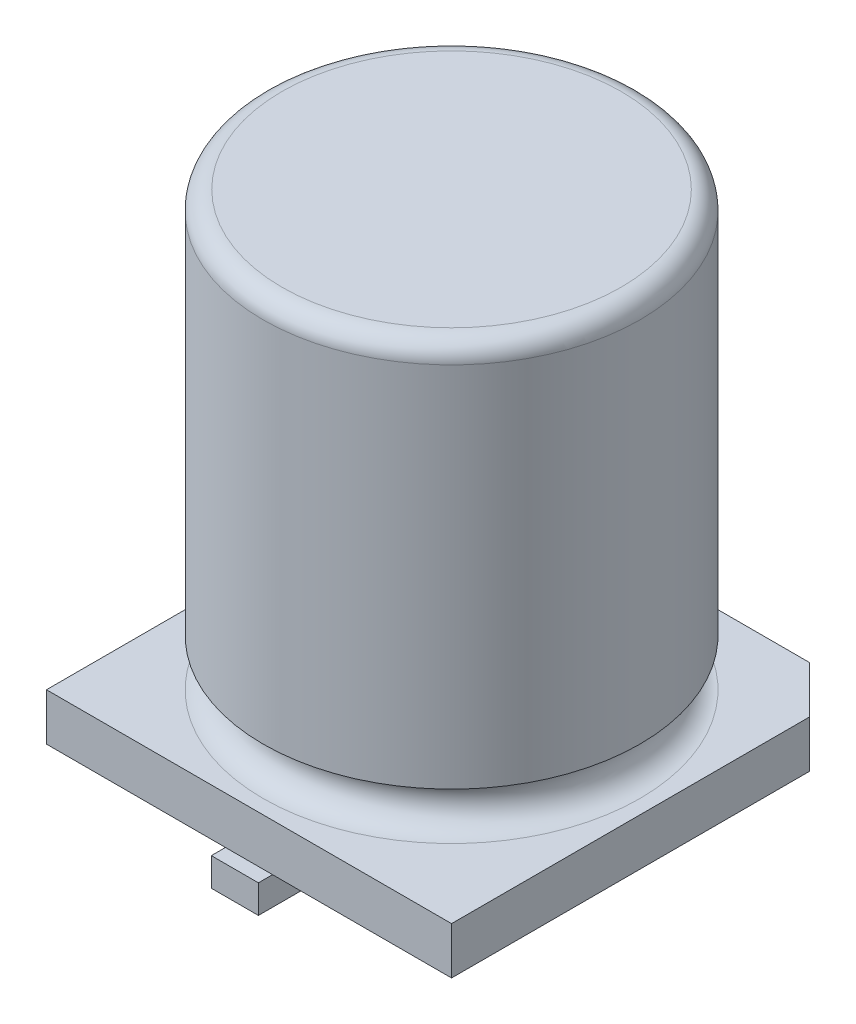
ISO-10303-21;
HEADER;
FILE_DESCRIPTION(('STEP AP214'),'2;1');
FILE_NAME('part.step','',(''),(''),'','','');
FILE_SCHEMA(('AUTOMOTIVE_DESIGN { 1 0 10303 214 1 1 1 1 }'));
ENDSEC;
DATA;
#1=APPLICATION_CONTEXT('core data for automotive mechanical design processes');
#2=APPLICATION_PROTOCOL_DEFINITION('international standard','automotive_design',2000,#1);
#3=PRODUCT_CONTEXT('',#1,'mechanical');
#4=PRODUCT('Part','Part','',(#3));
#5=PRODUCT_RELATED_PRODUCT_CATEGORY('part','',(#4));
#6=PRODUCT_DEFINITION_FORMATION('','',#4);
#7=PRODUCT_DEFINITION_CONTEXT('part definition',#1,'design');
#8=PRODUCT_DEFINITION('design','',#6,#7);
#9=PRODUCT_DEFINITION_SHAPE('','',#8);
#10=(LENGTH_UNIT() NAMED_UNIT(*) SI_UNIT(.MILLI.,.METRE.));
#11=(NAMED_UNIT(*) PLANE_ANGLE_UNIT() SI_UNIT($,.RADIAN.));
#12=(NAMED_UNIT(*) SI_UNIT($,.STERADIAN.) SOLID_ANGLE_UNIT());
#13=UNCERTAINTY_MEASURE_WITH_UNIT(LENGTH_MEASURE(1.E-05),#10,'distance_accuracy_value','');
#14=(GEOMETRIC_REPRESENTATION_CONTEXT(3) GLOBAL_UNCERTAINTY_ASSIGNED_CONTEXT((#13)) GLOBAL_UNIT_ASSIGNED_CONTEXT((#10,
#11,#12)) REPRESENTATION_CONTEXT('',''));
#15=CARTESIAN_POINT('',(0.,0.,0.));
#16=DIRECTION('',(0.,0.,1.));
#17=DIRECTION('',(1.,0.,0.));
#18=AXIS2_PLACEMENT_3D('',#15,#16,#17);
#19=CARTESIAN_POINT('',(0.,0.8,0.));
#20=DIRECTION('',(0.,1.,0.));
#21=DIRECTION('',(0.,0.,1.));
#22=AXIS2_PLACEMENT_3D('',#19,#20,#21);
#23=PLANE('',#22);
#24=DIRECTION('',(-0.707106781186548,0.,0.707106781186547));
#25=VECTOR('',#24,1.);
#26=CARTESIAN_POINT('',(-2.15,0.8,-1.65));
#27=LINE('',#26,#25);
#28=CARTESIAN_POINT('',(-1.65,0.8,-2.15));
#29=VERTEX_POINT('',#28);
#30=CARTESIAN_POINT('',(-2.15,0.8,-1.65));
#31=VERTEX_POINT('',#30);
#32=EDGE_CURVE('E195',#29,#31,#27,.T.);
#33=ORIENTED_EDGE('',*,*,#32,.T.);
#34=DIRECTION('',(0.,0.,1.));
#35=VECTOR('',#34,1.);
#36=CARTESIAN_POINT('',(-2.15,0.8,2.15));
#37=LINE('',#36,#35);
#38=CARTESIAN_POINT('',(-2.15,0.8,2.15));
#39=VERTEX_POINT('',#38);
#40=EDGE_CURVE('E198',#31,#39,#37,.T.);
#41=ORIENTED_EDGE('',*,*,#40,.T.);
#42=DIRECTION('',(1.,0.,0.));
#43=VECTOR('',#42,1.);
#44=CARTESIAN_POINT('',(-2.15,0.8,2.15));
#45=LINE('',#44,#43);
#46=CARTESIAN_POINT('',(2.15,0.8,2.15));
#47=VERTEX_POINT('',#46);
#48=EDGE_CURVE('E201',#39,#47,#45,.T.);
#49=ORIENTED_EDGE('',*,*,#48,.T.);
#50=DIRECTION('',(0.,0.,-1.));
#51=VECTOR('',#50,1.);
#52=CARTESIAN_POINT('',(2.15,0.8,2.15));
#53=LINE('',#52,#51);
#54=CARTESIAN_POINT('',(2.15,0.8,-1.65));
#55=VERTEX_POINT('',#54);
#56=EDGE_CURVE('E203',#47,#55,#53,.T.);
#57=ORIENTED_EDGE('',*,*,#56,.T.);
#58=DIRECTION('',(-0.707106781186548,0.,-0.707106781186547));
#59=VECTOR('',#58,1.);
#60=CARTESIAN_POINT('',(2.15,0.8,-1.65));
#61=LINE('',#60,#59);
#62=CARTESIAN_POINT('',(1.65,0.8,-2.15));
#63=VERTEX_POINT('',#62);
#64=EDGE_CURVE('E205',#55,#63,#61,.T.);
#65=ORIENTED_EDGE('',*,*,#64,.T.);
#66=DIRECTION('',(-1.,0.,0.));
#67=VECTOR('',#66,1.);
#68=CARTESIAN_POINT('',(1.65,0.8,-2.15));
#69=LINE('',#68,#67);
#70=EDGE_CURVE('E207',#63,#29,#69,.T.);
#71=ORIENTED_EDGE('',*,*,#70,.T.);
#72=EDGE_LOOP('',(#33,#41,#49,#57,#65,#71));
#73=FACE_BOUND('',#72,.T.);
#74=CARTESIAN_POINT('',(0.,0.8,0.));
#75=DIRECTION('',(0.,1.,0.));
#76=DIRECTION('',(0.,0.,1.));
#77=AXIS2_PLACEMENT_3D('',#74,#75,#76);
#78=CIRCLE('',#77,2.);
#79=CARTESIAN_POINT('',(0.,0.8,2.));
#80=VERTEX_POINT('',#79);
#81=EDGE_CURVE('E180',#80,#80,#78,.F.);
#82=ORIENTED_EDGE('',*,*,#81,.T.);
#83=EDGE_LOOP('',(#82));
#84=FACE_BOUND('',#83,.T.);
#85=ADVANCED_FACE('F33',(#73,#84),#23,.T.);
#86=CARTESIAN_POINT('',(0.,0.3,0.));
#87=DIRECTION('',(0.,1.,0.));
#88=DIRECTION('',(0.,0.,1.));
#89=AXIS2_PLACEMENT_3D('',#86,#87,#88);
#90=PLANE('',#89);
#91=DIRECTION('',(0.,0.,1.));
#92=VECTOR('',#91,1.);
#93=CARTESIAN_POINT('',(-0.25,0.3,2.3));
#94=LINE('',#93,#92);
#95=CARTESIAN_POINT('',(-0.25,0.3,0.75));
#96=VERTEX_POINT('',#95);
#97=CARTESIAN_POINT('',(-0.25,0.3,2.15));
#98=VERTEX_POINT('',#97);
#99=EDGE_CURVE('E148',#96,#98,#94,.T.);
#100=ORIENTED_EDGE('',*,*,#99,.T.);
#101=DIRECTION('',(1.,0.,0.));
#102=VECTOR('',#101,1.);
#103=CARTESIAN_POINT('',(-2.15,0.3,2.15));
#104=LINE('',#103,#102);
#105=CARTESIAN_POINT('',(-2.15,0.3,2.15));
#106=VERTEX_POINT('',#105);
#107=EDGE_CURVE('E215',#106,#98,#104,.T.);
#108=ORIENTED_EDGE('',*,*,#107,.F.);
#109=DIRECTION('',(0.,0.,1.));
#110=VECTOR('',#109,1.);
#111=CARTESIAN_POINT('',(-2.15,0.3,2.15));
#112=LINE('',#111,#110);
#113=CARTESIAN_POINT('',(-2.15,0.3,-1.65));
#114=VERTEX_POINT('',#113);
#115=EDGE_CURVE('E212',#114,#106,#112,.T.);
#116=ORIENTED_EDGE('',*,*,#115,.F.);
#117=DIRECTION('',(-0.707106781186548,0.,0.707106781186547));
#118=VECTOR('',#117,1.);
#119=CARTESIAN_POINT('',(-2.15,0.3,-1.65));
#120=LINE('',#119,#118);
#121=CARTESIAN_POINT('',(-1.65,0.3,-2.15));
#122=VERTEX_POINT('',#121);
#123=EDGE_CURVE('E169',#122,#114,#120,.T.);
#124=ORIENTED_EDGE('',*,*,#123,.F.);
#125=DIRECTION('',(-1.,0.,0.));
#126=VECTOR('',#125,1.);
#127=CARTESIAN_POINT('',(1.65,0.3,-2.15));
#128=LINE('',#127,#126);
#129=CARTESIAN_POINT('',(-0.25,0.3,-2.15));
#130=VERTEX_POINT('',#129);
#131=EDGE_CURVE('E222',#130,#122,#128,.T.);
#132=ORIENTED_EDGE('',*,*,#131,.F.);
#133=DIRECTION('',(0.,0.,1.));
#134=VECTOR('',#133,1.);
#135=CARTESIAN_POINT('',(-0.25,0.3,-2.3));
#136=LINE('',#135,#134);
#137=CARTESIAN_POINT('',(-0.25,0.3,-0.75));
#138=VERTEX_POINT('',#137);
#139=EDGE_CURVE('E253',#130,#138,#136,.T.);
#140=ORIENTED_EDGE('',*,*,#139,.T.);
#141=CARTESIAN_POINT('',(0.,0.3,-0.75));
#142=DIRECTION('',(0.,1.,0.));
#143=DIRECTION('',(0.,0.,1.));
#144=AXIS2_PLACEMENT_3D('',#141,#142,#143);
#145=CIRCLE('',#144,0.25);
#146=CARTESIAN_POINT('',(0.25,0.3,-0.75));
#147=VERTEX_POINT('',#146);
#148=EDGE_CURVE('E243',#138,#147,#145,.T.);
#149=ORIENTED_EDGE('',*,*,#148,.T.);
#150=DIRECTION('',(0.,0.,-1.));
#151=VECTOR('',#150,1.);
#152=CARTESIAN_POINT('',(0.25,0.3,-0.75));
#153=LINE('',#152,#151);
#154=CARTESIAN_POINT('',(0.25,0.3,-2.15));
#155=VERTEX_POINT('',#154);
#156=EDGE_CURVE('E248',#147,#155,#153,.T.);
#157=ORIENTED_EDGE('',*,*,#156,.T.);
#158=CARTESIAN_POINT('',(1.65,0.3,-2.15));
#159=VERTEX_POINT('',#158);
#160=EDGE_CURVE('E199',#159,#155,#128,.T.);
#161=ORIENTED_EDGE('',*,*,#160,.F.);
#162=DIRECTION('',(-0.707106781186548,0.,-0.707106781186547));
#163=VECTOR('',#162,1.);
#164=CARTESIAN_POINT('',(2.15,0.3,-1.65));
#165=LINE('',#164,#163);
#166=CARTESIAN_POINT('',(2.15,0.3,-1.65));
#167=VERTEX_POINT('',#166);
#168=EDGE_CURVE('E220',#167,#159,#165,.T.);
#169=ORIENTED_EDGE('',*,*,#168,.F.);
#170=DIRECTION('',(0.,0.,-1.));
#171=VECTOR('',#170,1.);
#172=CARTESIAN_POINT('',(2.15,0.3,2.15));
#173=LINE('',#172,#171);
#174=CARTESIAN_POINT('',(2.15,0.3,2.15));
#175=VERTEX_POINT('',#174);
#176=EDGE_CURVE('E217',#175,#167,#173,.T.);
#177=ORIENTED_EDGE('',*,*,#176,.F.);
#178=CARTESIAN_POINT('',(0.25,0.3,2.15));
#179=VERTEX_POINT('',#178);
#180=EDGE_CURVE('E214',#179,#175,#104,.T.);
#181=ORIENTED_EDGE('',*,*,#180,.F.);
#182=DIRECTION('',(0.,0.,-1.));
#183=VECTOR('',#182,1.);
#184=CARTESIAN_POINT('',(0.25,0.3,0.75));
#185=LINE('',#184,#183);
#186=CARTESIAN_POINT('',(0.25,0.3,0.75));
#187=VERTEX_POINT('',#186);
#188=EDGE_CURVE('E174',#179,#187,#185,.T.);
#189=ORIENTED_EDGE('',*,*,#188,.T.);
#190=CARTESIAN_POINT('',(0.,0.3,0.75));
#191=DIRECTION('',(0.,1.,0.));
#192=DIRECTION('',(0.,0.,-1.));
#193=AXIS2_PLACEMENT_3D('',#190,#191,#192);
#194=CIRCLE('',#193,0.25);
#195=EDGE_CURVE('E165',#187,#96,#194,.T.);
#196=ORIENTED_EDGE('',*,*,#195,.T.);
#197=EDGE_LOOP('',(#100,#108,#116,#124,#132,#140,#149,#157,#161,#169,#177,#181,#189,#196));
#198=FACE_BOUND('',#197,.T.);
#199=ADVANCED_FACE('F172',(#198),#90,.F.);
#200=CARTESIAN_POINT('',(0.,0.3,-0.75));
#201=DIRECTION('',(0.,-1.,0.));
#202=DIRECTION('',(0.,0.,-1.));
#203=AXIS2_PLACEMENT_3D('',#200,#201,#202);
#204=CYLINDRICAL_SURFACE('',#203,0.25);
#205=CARTESIAN_POINT('',(0.,0.,-0.75));
#206=DIRECTION('',(0.,1.,0.));
#207=DIRECTION('',(0.,0.,1.));
#208=AXIS2_PLACEMENT_3D('',#205,#206,#207);
#209=CIRCLE('',#208,0.25);
#210=CARTESIAN_POINT('',(-0.25,0.,-0.75));
#211=VERTEX_POINT('',#210);
#212=CARTESIAN_POINT('',(0.25,0.,-0.75));
#213=VERTEX_POINT('',#212);
#214=EDGE_CURVE('E242',#211,#213,#209,.T.);
#215=ORIENTED_EDGE('',*,*,#214,.T.);
#216=DIRECTION('',(0.,-1.,0.));
#217=VECTOR('',#216,1.);
#218=CARTESIAN_POINT('',(0.25,0.3,-0.75));
#219=LINE('',#218,#217);
#220=EDGE_CURVE('E272',#147,#213,#219,.T.);
#221=ORIENTED_EDGE('',*,*,#220,.F.);
#222=ORIENTED_EDGE('',*,*,#148,.F.);
#223=DIRECTION('',(0.,-1.,0.));
#224=VECTOR('',#223,1.);
#225=CARTESIAN_POINT('',(-0.25,0.3,-0.75));
#226=LINE('',#225,#224);
#227=EDGE_CURVE('E256',#138,#211,#226,.T.);
#228=ORIENTED_EDGE('',*,*,#227,.T.);
#229=EDGE_LOOP('',(#215,#221,#222,#228));
#230=FACE_BOUND('',#229,.T.);
#231=ADVANCED_FACE('F307',(#230),#204,.T.);
#232=CARTESIAN_POINT('',(0.25,0.3,-0.75));
#233=DIRECTION('',(-1.,0.,0.));
#234=DIRECTION('',(0.,0.,1.));
#235=AXIS2_PLACEMENT_3D('',#232,#233,#234);
#236=PLANE('',#235);
#237=DIRECTION('',(0.,0.,-1.));
#238=VECTOR('',#237,1.);
#239=CARTESIAN_POINT('',(0.25,0.,-0.75));
#240=LINE('',#239,#238);
#241=CARTESIAN_POINT('',(0.25,0.,-2.3));
#242=VERTEX_POINT('',#241);
#243=EDGE_CURVE('E259',#213,#242,#240,.T.);
#244=ORIENTED_EDGE('',*,*,#243,.T.);
#245=DIRECTION('',(0.,-1.,0.));
#246=VECTOR('',#245,1.);
#247=CARTESIAN_POINT('',(0.25,0.3,-2.3));
#248=LINE('',#247,#246);
#249=CARTESIAN_POINT('',(0.25,0.3,-2.3));
#250=VERTEX_POINT('',#249);
#251=EDGE_CURVE('E269',#250,#242,#248,.T.);
#252=ORIENTED_EDGE('',*,*,#251,.F.);
#253=EDGE_CURVE('E246',#155,#250,#153,.T.);
#254=ORIENTED_EDGE('',*,*,#253,.F.);
#255=ORIENTED_EDGE('',*,*,#156,.F.);
#256=ORIENTED_EDGE('',*,*,#220,.T.);
#257=EDGE_LOOP('',(#244,#252,#254,#255,#256));
#258=FACE_BOUND('',#257,.T.);
#259=ADVANCED_FACE('F304',(#258),#236,.F.);
#260=CARTESIAN_POINT('',(0.25,0.3,-2.3));
#261=DIRECTION('',(0.,0.,1.));
#262=DIRECTION('',(1.,0.,0.));
#263=AXIS2_PLACEMENT_3D('',#260,#261,#262);
#264=PLANE('',#263);
#265=DIRECTION('',(-1.,0.,0.));
#266=VECTOR('',#265,1.);
#267=CARTESIAN_POINT('',(0.25,0.,-2.3));
#268=LINE('',#267,#266);
#269=CARTESIAN_POINT('',(-0.25,0.,-2.3));
#270=VERTEX_POINT('',#269);
#271=EDGE_CURVE('E261',#242,#270,#268,.T.);
#272=ORIENTED_EDGE('',*,*,#271,.T.);
#273=DIRECTION('',(0.,-1.,0.));
#274=VECTOR('',#273,1.);
#275=CARTESIAN_POINT('',(-0.25,0.3,-2.3));
#276=LINE('',#275,#274);
#277=CARTESIAN_POINT('',(-0.25,0.3,-2.3));
#278=VERTEX_POINT('',#277);
#279=EDGE_CURVE('E266',#278,#270,#276,.T.);
#280=ORIENTED_EDGE('',*,*,#279,.F.);
#281=DIRECTION('',(-1.,0.,0.));
#282=VECTOR('',#281,1.);
#283=CARTESIAN_POINT('',(0.25,0.3,-2.3));
#284=LINE('',#283,#282);
#285=EDGE_CURVE('E251',#250,#278,#284,.T.);
#286=ORIENTED_EDGE('',*,*,#285,.F.);
#287=ORIENTED_EDGE('',*,*,#251,.T.);
#288=EDGE_LOOP('',(#272,#280,#286,#287));
#289=FACE_BOUND('',#288,.T.);
#290=ADVANCED_FACE('F315',(#289),#264,.F.);
#291=CARTESIAN_POINT('',(-0.25,0.3,-2.3));
#292=DIRECTION('',(1.,0.,0.));
#293=DIRECTION('',(0.,0.,-1.));
#294=AXIS2_PLACEMENT_3D('',#291,#292,#293);
#295=PLANE('',#294);
#296=DIRECTION('',(0.,0.,1.));
#297=VECTOR('',#296,1.);
#298=CARTESIAN_POINT('',(-0.25,0.,-2.3));
#299=LINE('',#298,#297);
#300=EDGE_CURVE('E247',#270,#211,#299,.T.);
#301=ORIENTED_EDGE('',*,*,#300,.T.);
#302=ORIENTED_EDGE('',*,*,#227,.F.);
#303=ORIENTED_EDGE('',*,*,#139,.F.);
#304=EDGE_CURVE('E254',#278,#130,#136,.T.);
#305=ORIENTED_EDGE('',*,*,#304,.F.);
#306=ORIENTED_EDGE('',*,*,#279,.T.);
#307=EDGE_LOOP('',(#301,#302,#303,#305,#306));
#308=FACE_BOUND('',#307,.T.);
#309=ADVANCED_FACE('F321',(#308),#295,.F.);
#310=CARTESIAN_POINT('',(0.,0.3,-0.75));
#311=DIRECTION('',(0.,1.,0.));
#312=DIRECTION('',(0.,0.,1.));
#313=AXIS2_PLACEMENT_3D('',#310,#311,#312);
#314=PLANE('',#313);
#315=EDGE_CURVE('E57',#155,#130,#128,.T.);
#316=ORIENTED_EDGE('',*,*,#315,.F.);
#317=ORIENTED_EDGE('',*,*,#253,.T.);
#318=ORIENTED_EDGE('',*,*,#285,.T.);
#319=ORIENTED_EDGE('',*,*,#304,.T.);
#320=EDGE_LOOP('',(#316,#317,#318,#319));
#321=FACE_BOUND('',#320,.T.);
#322=ADVANCED_FACE('F318',(#321),#314,.T.);
#323=CARTESIAN_POINT('',(0.,0.,-0.75));
#324=DIRECTION('',(0.,1.,0.));
#325=DIRECTION('',(0.,0.,1.));
#326=AXIS2_PLACEMENT_3D('',#323,#324,#325);
#327=PLANE('',#326);
#328=ORIENTED_EDGE('',*,*,#214,.F.);
#329=ORIENTED_EDGE('',*,*,#300,.F.);
#330=ORIENTED_EDGE('',*,*,#271,.F.);
#331=ORIENTED_EDGE('',*,*,#243,.F.);
#332=EDGE_LOOP('',(#328,#329,#330,#331));
#333=FACE_BOUND('',#332,.T.);
#334=ADVANCED_FACE('F311',(#333),#327,.F.);
#335=CARTESIAN_POINT('',(-2.15,0.8,-1.65));
#336=DIRECTION('',(0.707106781186547,0.,0.707106781186548));
#337=DIRECTION('',(0.707106781186548,0.,-0.707106781186547));
#338=AXIS2_PLACEMENT_3D('',#335,#336,#337);
#339=PLANE('',#338);
#340=ORIENTED_EDGE('',*,*,#123,.T.);
#341=DIRECTION('',(0.,-1.,0.));
#342=VECTOR('',#341,1.);
#343=CARTESIAN_POINT('',(-2.15,0.8,-1.65));
#344=LINE('',#343,#342);
#345=EDGE_CURVE('E239',#31,#114,#344,.T.);
#346=ORIENTED_EDGE('',*,*,#345,.F.);
#347=ORIENTED_EDGE('',*,*,#32,.F.);
#348=DIRECTION('',(0.,-1.,0.));
#349=VECTOR('',#348,1.);
#350=CARTESIAN_POINT('',(-1.65,0.8,-2.15));
#351=LINE('',#350,#349);
#352=EDGE_CURVE('E209',#29,#122,#351,.T.);
#353=ORIENTED_EDGE('',*,*,#352,.T.);
#354=EDGE_LOOP('',(#340,#346,#347,#353));
#355=FACE_BOUND('',#354,.T.);
#356=ADVANCED_FACE('F287',(#355),#339,.F.);
#357=CARTESIAN_POINT('',(-2.15,0.8,2.15));
#358=DIRECTION('',(1.,0.,0.));
#359=DIRECTION('',(0.,0.,-1.));
#360=AXIS2_PLACEMENT_3D('',#357,#358,#359);
#361=PLANE('',#360);
#362=ORIENTED_EDGE('',*,*,#115,.T.);
#363=DIRECTION('',(0.,-1.,0.));
#364=VECTOR('',#363,1.);
#365=CARTESIAN_POINT('',(-2.15,0.8,2.15));
#366=LINE('',#365,#364);
#367=EDGE_CURVE('E236',#39,#106,#366,.T.);
#368=ORIENTED_EDGE('',*,*,#367,.F.);
#369=ORIENTED_EDGE('',*,*,#40,.F.);
#370=ORIENTED_EDGE('',*,*,#345,.T.);
#371=EDGE_LOOP('',(#362,#368,#369,#370));
#372=FACE_BOUND('',#371,.T.);
#373=ADVANCED_FACE('F291',(#372),#361,.F.);
#374=CARTESIAN_POINT('',(-2.15,0.8,2.15));
#375=DIRECTION('',(0.,0.,-1.));
#376=DIRECTION('',(-1.,0.,0.));
#377=AXIS2_PLACEMENT_3D('',#374,#375,#376);
#378=PLANE('',#377);
#379=ORIENTED_EDGE('',*,*,#107,.T.);
#380=EDGE_CURVE('E218',#98,#179,#104,.T.);
#381=ORIENTED_EDGE('',*,*,#380,.T.);
#382=ORIENTED_EDGE('',*,*,#180,.T.);
#383=DIRECTION('',(0.,-1.,0.));
#384=VECTOR('',#383,1.);
#385=CARTESIAN_POINT('',(2.15,0.8,2.15));
#386=LINE('',#385,#384);
#387=EDGE_CURVE('E233',#47,#175,#386,.T.);
#388=ORIENTED_EDGE('',*,*,#387,.F.);
#389=ORIENTED_EDGE('',*,*,#48,.F.);
#390=ORIENTED_EDGE('',*,*,#367,.T.);
#391=EDGE_LOOP('',(#379,#381,#382,#388,#389,#390));
#392=FACE_BOUND('',#391,.T.);
#393=ADVANCED_FACE('F349',(#392),#378,.F.);
#394=CARTESIAN_POINT('',(2.15,0.8,2.15));
#395=DIRECTION('',(-1.,0.,0.));
#396=DIRECTION('',(0.,0.,1.));
#397=AXIS2_PLACEMENT_3D('',#394,#395,#396);
#398=PLANE('',#397);
#399=ORIENTED_EDGE('',*,*,#176,.T.);
#400=DIRECTION('',(0.,-1.,0.));
#401=VECTOR('',#400,1.);
#402=CARTESIAN_POINT('',(2.15,0.8,-1.65));
#403=LINE('',#402,#401);
#404=EDGE_CURVE('E230',#55,#167,#403,.T.);
#405=ORIENTED_EDGE('',*,*,#404,.F.);
#406=ORIENTED_EDGE('',*,*,#56,.F.);
#407=ORIENTED_EDGE('',*,*,#387,.T.);
#408=EDGE_LOOP('',(#399,#405,#406,#407));
#409=FACE_BOUND('',#408,.T.);
#410=ADVANCED_FACE('F346',(#409),#398,.F.);
#411=CARTESIAN_POINT('',(2.15,0.8,-1.65));
#412=DIRECTION('',(-0.707106781186547,0.,0.707106781186548));
#413=DIRECTION('',(0.707106781186548,0.,0.707106781186547));
#414=AXIS2_PLACEMENT_3D('',#411,#412,#413);
#415=PLANE('',#414);
#416=ORIENTED_EDGE('',*,*,#168,.T.);
#417=DIRECTION('',(0.,-1.,0.));
#418=VECTOR('',#417,1.);
#419=CARTESIAN_POINT('',(1.65,0.8,-2.15));
#420=LINE('',#419,#418);
#421=EDGE_CURVE('E227',#63,#159,#420,.T.);
#422=ORIENTED_EDGE('',*,*,#421,.F.);
#423=ORIENTED_EDGE('',*,*,#64,.F.);
#424=ORIENTED_EDGE('',*,*,#404,.T.);
#425=EDGE_LOOP('',(#416,#422,#423,#424));
#426=FACE_BOUND('',#425,.T.);
#427=ADVANCED_FACE('F343',(#426),#415,.F.);
#428=CARTESIAN_POINT('',(1.65,0.8,-2.15));
#429=DIRECTION('',(0.,0.,1.));
#430=DIRECTION('',(1.,0.,0.));
#431=AXIS2_PLACEMENT_3D('',#428,#429,#430);
#432=PLANE('',#431);
#433=ORIENTED_EDGE('',*,*,#160,.T.);
#434=ORIENTED_EDGE('',*,*,#315,.T.);
#435=ORIENTED_EDGE('',*,*,#131,.T.);
#436=ORIENTED_EDGE('',*,*,#352,.F.);
#437=ORIENTED_EDGE('',*,*,#70,.F.);
#438=ORIENTED_EDGE('',*,*,#421,.T.);
#439=EDGE_LOOP('',(#433,#434,#435,#436,#437,#438));
#440=FACE_BOUND('',#439,.T.);
#441=ADVANCED_FACE('F281',(#440),#432,.F.);
#442=CARTESIAN_POINT('',(0.,0.3,0.75));
#443=DIRECTION('',(0.,-1.,0.));
#444=DIRECTION('',(0.,0.,-1.));
#445=AXIS2_PLACEMENT_3D('',#442,#443,#444);
#446=PLANE('',#445);
#447=CARTESIAN_POINT('',(0.25,0.3,2.3));
#448=VERTEX_POINT('',#447);
#449=EDGE_CURVE('E49',#448,#179,#185,.T.);
#450=ORIENTED_EDGE('',*,*,#449,.T.);
#451=ORIENTED_EDGE('',*,*,#380,.F.);
#452=CARTESIAN_POINT('',(-0.25,0.3,2.3));
#453=VERTEX_POINT('',#452);
#454=EDGE_CURVE('E154',#98,#453,#94,.T.);
#455=ORIENTED_EDGE('',*,*,#454,.T.);
#456=DIRECTION('',(1.,0.,0.));
#457=VECTOR('',#456,1.);
#458=CARTESIAN_POINT('',(0.25,0.3,2.3));
#459=LINE('',#458,#457);
#460=EDGE_CURVE('E159',#453,#448,#459,.T.);
#461=ORIENTED_EDGE('',*,*,#460,.T.);
#462=EDGE_LOOP('',(#450,#451,#455,#461));
#463=FACE_BOUND('',#462,.T.);
#464=ADVANCED_FACE('F342',(#463),#446,.F.);
#465=CARTESIAN_POINT('',(0.,0.3,0.75));
#466=DIRECTION('',(0.,-1.,0.));
#467=DIRECTION('',(0.,0.,-1.));
#468=AXIS2_PLACEMENT_3D('',#465,#466,#467);
#469=CYLINDRICAL_SURFACE('',#468,0.25);
#470=CARTESIAN_POINT('',(0.,0.,0.75));
#471=DIRECTION('',(0.,1.,0.));
#472=DIRECTION('',(0.,0.,-1.));
#473=AXIS2_PLACEMENT_3D('',#470,#471,#472);
#474=CIRCLE('',#473,0.25);
#475=CARTESIAN_POINT('',(0.25,0.,0.75));
#476=VERTEX_POINT('',#475);
#477=CARTESIAN_POINT('',(-0.25,0.,0.75));
#478=VERTEX_POINT('',#477);
#479=EDGE_CURVE('E168',#476,#478,#474,.T.);
#480=ORIENTED_EDGE('',*,*,#479,.T.);
#481=DIRECTION('',(0.,-1.,0.));
#482=VECTOR('',#481,1.);
#483=CARTESIAN_POINT('',(-0.25,0.3,0.75));
#484=LINE('',#483,#482);
#485=EDGE_CURVE('E151',#96,#478,#484,.T.);
#486=ORIENTED_EDGE('',*,*,#485,.F.);
#487=ORIENTED_EDGE('',*,*,#195,.F.);
#488=DIRECTION('',(0.,-1.,0.));
#489=VECTOR('',#488,1.);
#490=CARTESIAN_POINT('',(0.25,0.3,0.75));
#491=LINE('',#490,#489);
#492=EDGE_CURVE('E184',#187,#476,#491,.T.);
#493=ORIENTED_EDGE('',*,*,#492,.T.);
#494=EDGE_LOOP('',(#480,#486,#487,#493));
#495=FACE_BOUND('',#494,.T.);
#496=ADVANCED_FACE('F163',(#495),#469,.T.);
#497=CARTESIAN_POINT('',(-0.25,0.3,2.3));
#498=DIRECTION('',(1.,0.,0.));
#499=DIRECTION('',(0.,0.,-1.));
#500=AXIS2_PLACEMENT_3D('',#497,#498,#499);
#501=PLANE('',#500);
#502=DIRECTION('',(0.,0.,1.));
#503=VECTOR('',#502,1.);
#504=CARTESIAN_POINT('',(-0.25,0.,2.3));
#505=LINE('',#504,#503);
#506=CARTESIAN_POINT('',(-0.25,0.,2.3));
#507=VERTEX_POINT('',#506);
#508=EDGE_CURVE('E186',#478,#507,#505,.T.);
#509=ORIENTED_EDGE('',*,*,#508,.T.);
#510=DIRECTION('',(0.,-1.,0.));
#511=VECTOR('',#510,1.);
#512=CARTESIAN_POINT('',(-0.25,0.3,2.3));
#513=LINE('',#512,#511);
#514=EDGE_CURVE('E170',#453,#507,#513,.T.);
#515=ORIENTED_EDGE('',*,*,#514,.F.);
#516=ORIENTED_EDGE('',*,*,#454,.F.);
#517=ORIENTED_EDGE('',*,*,#99,.F.);
#518=ORIENTED_EDGE('',*,*,#485,.T.);
#519=EDGE_LOOP('',(#509,#515,#516,#517,#518));
#520=FACE_BOUND('',#519,.T.);
#521=ADVANCED_FACE('F150',(#520),#501,.F.);
#522=CARTESIAN_POINT('',(0.25,0.3,2.3));
#523=DIRECTION('',(0.,0.,-1.));
#524=DIRECTION('',(-1.,0.,0.));
#525=AXIS2_PLACEMENT_3D('',#522,#523,#524);
#526=PLANE('',#525);
#527=DIRECTION('',(1.,0.,0.));
#528=VECTOR('',#527,1.);
#529=CARTESIAN_POINT('',(0.25,0.,2.3));
#530=LINE('',#529,#528);
#531=CARTESIAN_POINT('',(0.25,0.,2.3));
#532=VERTEX_POINT('',#531);
#533=EDGE_CURVE('E177',#507,#532,#530,.T.);
#534=ORIENTED_EDGE('',*,*,#533,.T.);
#535=DIRECTION('',(0.,-1.,0.));
#536=VECTOR('',#535,1.);
#537=CARTESIAN_POINT('',(0.25,0.3,2.3));
#538=LINE('',#537,#536);
#539=EDGE_CURVE('E190',#448,#532,#538,.T.);
#540=ORIENTED_EDGE('',*,*,#539,.F.);
#541=ORIENTED_EDGE('',*,*,#460,.F.);
#542=ORIENTED_EDGE('',*,*,#514,.T.);
#543=EDGE_LOOP('',(#534,#540,#541,#542));
#544=FACE_BOUND('',#543,.T.);
#545=ADVANCED_FACE('F405',(#544),#526,.F.);
#546=CARTESIAN_POINT('',(0.25,0.3,0.75));
#547=DIRECTION('',(-1.,0.,0.));
#548=DIRECTION('',(0.,0.,1.));
#549=AXIS2_PLACEMENT_3D('',#546,#547,#548);
#550=PLANE('',#549);
#551=DIRECTION('',(0.,0.,-1.));
#552=VECTOR('',#551,1.);
#553=CARTESIAN_POINT('',(0.25,0.,0.75));
#554=LINE('',#553,#552);
#555=EDGE_CURVE('E175',#532,#476,#554,.T.);
#556=ORIENTED_EDGE('',*,*,#555,.T.);
#557=ORIENTED_EDGE('',*,*,#492,.F.);
#558=ORIENTED_EDGE('',*,*,#188,.F.);
#559=ORIENTED_EDGE('',*,*,#449,.F.);
#560=ORIENTED_EDGE('',*,*,#539,.T.);
#561=EDGE_LOOP('',(#556,#557,#558,#559,#560));
#562=FACE_BOUND('',#561,.T.);
#563=ADVANCED_FACE('F411',(#562),#550,.F.);
#564=CARTESIAN_POINT('',(0.,0.,0.75));
#565=DIRECTION('',(0.,-1.,0.));
#566=DIRECTION('',(0.,0.,-1.));
#567=AXIS2_PLACEMENT_3D('',#564,#565,#566);
#568=PLANE('',#567);
#569=ORIENTED_EDGE('',*,*,#479,.F.);
#570=ORIENTED_EDGE('',*,*,#555,.F.);
#571=ORIENTED_EDGE('',*,*,#533,.F.);
#572=ORIENTED_EDGE('',*,*,#508,.F.);
#573=EDGE_LOOP('',(#569,#570,#571,#572));
#574=FACE_BOUND('',#573,.T.);
#575=ADVANCED_FACE('F419',(#574),#568,.T.);
#576=CARTESIAN_POINT('',(0.,1.05,0.));
#577=DIRECTION('',(0.,-1.,0.));
#578=DIRECTION('',(0.,0.,-1.));
#579=AXIS2_PLACEMENT_3D('',#576,#577,#578);
#580=TOROIDAL_SURFACE('',#579,2.,0.25);
#581=CARTESIAN_POINT('',(0.,1.3,0.));
#582=DIRECTION('',(0.,-1.,0.));
#583=DIRECTION('',(0.,0.,-1.));
#584=AXIS2_PLACEMENT_3D('',#581,#582,#583);
#585=CIRCLE('',#584,2.);
#586=CARTESIAN_POINT('',(0.,1.3,-2.));
#587=VERTEX_POINT('',#586);
#588=EDGE_CURVE('E37',#587,#587,#585,.F.);
#589=ORIENTED_EDGE('',*,*,#588,.F.);
#590=EDGE_LOOP('',(#589));
#591=FACE_BOUND('',#590,.T.);
#592=ORIENTED_EDGE('',*,*,#81,.F.);
#593=EDGE_LOOP('',(#592));
#594=FACE_BOUND('',#593,.T.);
#595=ADVANCED_FACE('F427',(#591,#594),#580,.F.);
#596=CARTESIAN_POINT('',(0.,5.4,0.));
#597=DIRECTION('',(0.,1.,0.));
#598=DIRECTION('',(0.,0.,1.));
#599=AXIS2_PLACEMENT_3D('',#596,#597,#598);
#600=PLANE('',#599);
#601=CARTESIAN_POINT('',(0.,5.4,0.));
#602=DIRECTION('',(0.,1.,0.));
#603=DIRECTION('',(0.,0.,1.));
#604=AXIS2_PLACEMENT_3D('',#601,#602,#603);
#605=CIRCLE('',#604,1.8);
#606=CARTESIAN_POINT('',(0.,5.4,1.8));
#607=VERTEX_POINT('',#606);
#608=EDGE_CURVE('E42',#607,#607,#605,.T.);
#609=ORIENTED_EDGE('',*,*,#608,.T.);
#610=EDGE_LOOP('',(#609));
#611=FACE_BOUND('',#610,.T.);
#612=ADVANCED_FACE('F435',(#611),#600,.T.);
#613=CARTESIAN_POINT('',(0.,5.2,0.));
#614=DIRECTION('',(0.,1.,0.));
#615=DIRECTION('',(0.,0.,1.));
#616=AXIS2_PLACEMENT_3D('',#613,#614,#615);
#617=TOROIDAL_SURFACE('',#616,1.8,0.2);
#618=CARTESIAN_POINT('',(0.,5.2,0.));
#619=DIRECTION('',(0.,1.,0.));
#620=DIRECTION('',(0.,0.,1.));
#621=AXIS2_PLACEMENT_3D('',#618,#619,#620);
#622=CIRCLE('',#621,2.);
#623=CARTESIAN_POINT('',(0.,5.2,-2.));
#624=VERTEX_POINT('',#623);
#625=EDGE_CURVE('E11',#624,#624,#622,.F.);
#626=ORIENTED_EDGE('',*,*,#625,.F.);
#627=EDGE_LOOP('',(#626));
#628=FACE_BOUND('',#627,.T.);
#629=ORIENTED_EDGE('',*,*,#608,.F.);
#630=EDGE_LOOP('',(#629));
#631=FACE_BOUND('',#630,.T.);
#632=ADVANCED_FACE('F35',(#628,#631),#617,.T.);
#633=CARTESIAN_POINT('',(0.,5.4,0.));
#634=DIRECTION('',(0.,-1.,0.));
#635=DIRECTION('',(0.,0.,-1.));
#636=AXIS2_PLACEMENT_3D('',#633,#634,#635);
#637=CYLINDRICAL_SURFACE('',#636,2.);
#638=CARTESIAN_POINT('',(0.,1.3,-2.));
#639=CARTESIAN_POINT('',(0.,1.340625,-2.));
#640=CARTESIAN_POINT('',(0.,1.38125,-2.));
#641=CARTESIAN_POINT('',(0.,1.4625,-2.));
#642=CARTESIAN_POINT('',(0.,1.503125,-2.));
#643=CARTESIAN_POINT('',(0.,1.584375,-2.));
#644=CARTESIAN_POINT('',(0.,1.625,-2.));
#645=CARTESIAN_POINT('',(0.,1.70625,-2.));
#646=CARTESIAN_POINT('',(0.,1.746875,-2.));
#647=CARTESIAN_POINT('',(0.,1.828125,-2.));
#648=CARTESIAN_POINT('',(0.,1.86875,-2.));
#649=CARTESIAN_POINT('',(0.,1.95,-2.));
#650=CARTESIAN_POINT('',(0.,1.990625,-2.));
#651=CARTESIAN_POINT('',(0.,2.071875,-2.));
#652=CARTESIAN_POINT('',(0.,2.1125,-2.));
#653=CARTESIAN_POINT('',(0.,2.19375,-2.));
#654=CARTESIAN_POINT('',(0.,2.234375,-2.));
#655=CARTESIAN_POINT('',(0.,2.315625,-2.));
#656=CARTESIAN_POINT('',(0.,2.35625,-2.));
#657=CARTESIAN_POINT('',(0.,2.4375,-2.));
#658=CARTESIAN_POINT('',(0.,2.478125,-2.));
#659=CARTESIAN_POINT('',(0.,2.559375,-2.));
#660=CARTESIAN_POINT('',(0.,2.6,-2.));
#661=CARTESIAN_POINT('',(0.,2.68125,-2.));
#662=CARTESIAN_POINT('',(0.,2.721875,-2.));
#663=CARTESIAN_POINT('',(0.,2.803125,-2.));
#664=CARTESIAN_POINT('',(0.,2.84375,-2.));
#665=CARTESIAN_POINT('',(0.,2.925,-2.));
#666=CARTESIAN_POINT('',(0.,2.965625,-2.));
#667=CARTESIAN_POINT('',(0.,3.046875,-2.));
#668=CARTESIAN_POINT('',(0.,3.0875,-2.));
#669=CARTESIAN_POINT('',(0.,3.16875,-2.));
#670=CARTESIAN_POINT('',(0.,3.209375,-2.));
#671=CARTESIAN_POINT('',(0.,3.290625,-2.));
#672=CARTESIAN_POINT('',(0.,3.33125,-2.));
#673=CARTESIAN_POINT('',(0.,3.4125,-2.));
#674=CARTESIAN_POINT('',(0.,3.453125,-2.));
#675=CARTESIAN_POINT('',(0.,3.534375,-2.));
#676=CARTESIAN_POINT('',(0.,3.575,-2.));
#677=CARTESIAN_POINT('',(0.,3.65625,-2.));
#678=CARTESIAN_POINT('',(0.,3.696875,-2.));
#679=CARTESIAN_POINT('',(0.,3.778125,-2.));
#680=CARTESIAN_POINT('',(0.,3.81875,-2.));
#681=CARTESIAN_POINT('',(0.,3.9,-2.));
#682=CARTESIAN_POINT('',(0.,3.940625,-2.));
#683=CARTESIAN_POINT('',(0.,4.021875,-2.));
#684=CARTESIAN_POINT('',(0.,4.0625,-2.));
#685=CARTESIAN_POINT('',(0.,4.14375,-2.));
#686=CARTESIAN_POINT('',(0.,4.184375,-2.));
#687=CARTESIAN_POINT('',(0.,4.265625,-2.));
#688=CARTESIAN_POINT('',(0.,4.30625,-2.));
#689=CARTESIAN_POINT('',(0.,4.3875,-2.));
#690=CARTESIAN_POINT('',(0.,4.428125,-2.));
#691=CARTESIAN_POINT('',(0.,4.509375,-2.));
#692=CARTESIAN_POINT('',(0.,4.55,-2.));
#693=CARTESIAN_POINT('',(0.,4.63125,-2.));
#694=CARTESIAN_POINT('',(0.,4.671875,-2.));
#695=CARTESIAN_POINT('',(0.,4.753125,-2.));
#696=CARTESIAN_POINT('',(0.,4.79375,-2.));
#697=CARTESIAN_POINT('',(0.,4.875,-2.));
#698=CARTESIAN_POINT('',(0.,4.915625,-2.));
#699=CARTESIAN_POINT('',(0.,4.996875,-2.));
#700=CARTESIAN_POINT('',(0.,5.0375,-2.));
#701=CARTESIAN_POINT('',(0.,5.11875,-2.));
#702=CARTESIAN_POINT('',(0.,5.159375,-2.));
#703=CARTESIAN_POINT('',(0.,5.2,-2.));
#704=B_SPLINE_CURVE_WITH_KNOTS('',3,(#638,#639,#640,#641,#642,#643,#644,#645,#646,#647,#648,
#649,#650,#651,#652,#653,#654,#655,#656,#657,#658,#659,#660,#661,#662,#663,#664,#665,#666,#667,
#668,#669,#670,#671,#672,#673,#674,#675,#676,#677,#678,#679,#680,#681,#682,#683,#684,#685,#686,
#687,#688,#689,#690,#691,#692,#693,#694,#695,#696,#697,#698,#699,#700,#701,#702,#703),
.UNSPECIFIED.,.F.,.F.,(4,2,2,2,2,2,2,2,2,2,2,2,2,2,2,2,2,2,2,2,2,2,2,2,2,2,2,2,2,2,2,2,4),(0.,
0.121875,0.24375,0.365625,0.4875,0.609375,0.73125,0.853125,0.975,1.096875,1.21875,1.340625,
1.4625,1.584375,1.70625,1.828125,1.95,2.071875,2.19375,2.315625,2.4375,2.559375,2.68125,
2.803125,2.925,3.046875,3.16875,3.290625,3.4125,3.534375,3.65625,3.778125,3.9),.UNSPECIFIED.);
#705=EDGE_CURVE('BSEAM450',#587,#624,#704,.T.);
#706=ORIENTED_EDGE('',*,*,#588,.T.);
#707=ORIENTED_EDGE('',*,*,#625,.T.);
#708=ORIENTED_EDGE('',*,*,#705,.T.);
#709=ORIENTED_EDGE('',*,*,#705,.F.);
#710=EDGE_LOOP('',(#706,#708,#707,#709));
#711=FACE_BOUND('',#710,.T.);
#712=ADVANCED_FACE('F450',(#711),#637,.T.);
#713=CLOSED_SHELL('',(#85,#199,#231,#259,#290,#309,#322,#334,#356,#373,#393,#410,#427,#441,#464,
#496,#521,#545,#563,#575,#595,#612,#632,#712));
#714=MANIFOLD_SOLID_BREP('B2',#713);
#715=ADVANCED_BREP_SHAPE_REPRESENTATION('',(#18,#714),#14);
#716=SHAPE_DEFINITION_REPRESENTATION(#9,#715);
ENDSEC;
END-ISO-10303-21;
